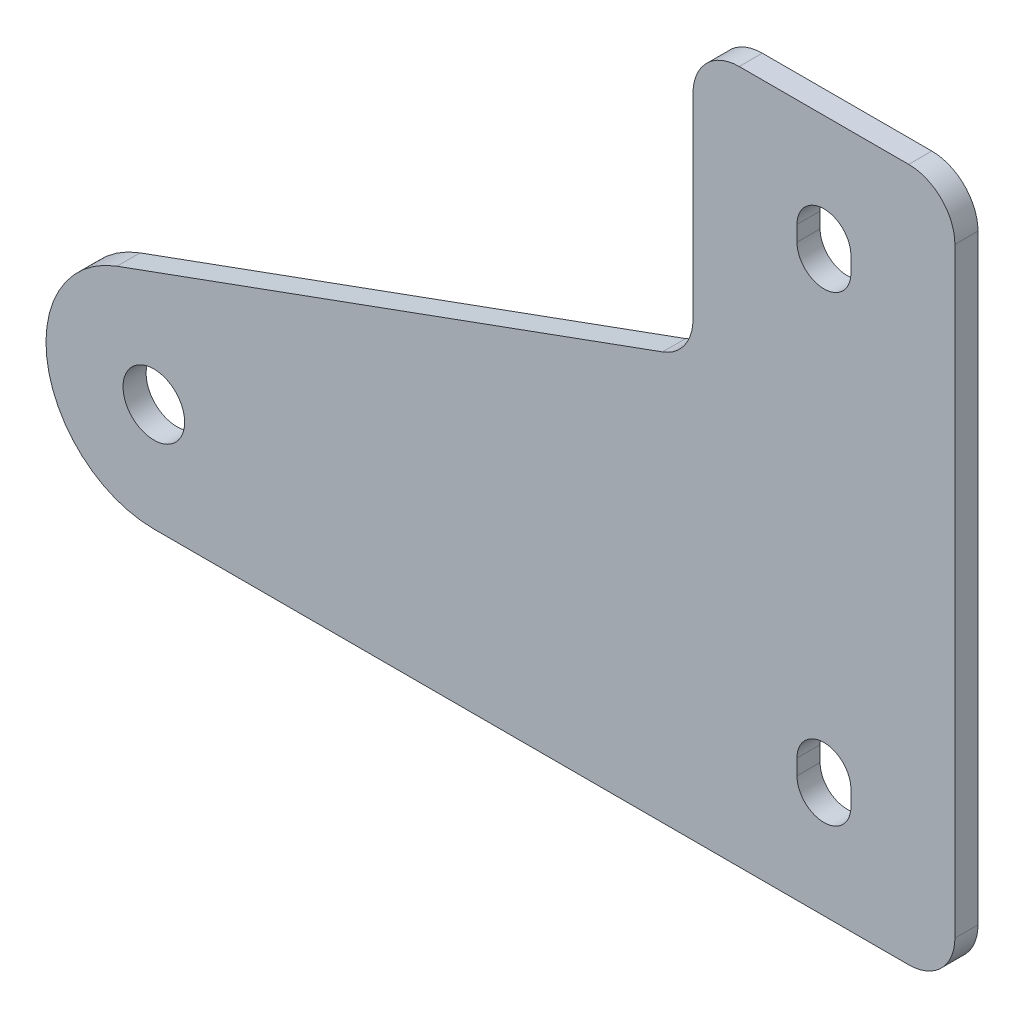
ISO-10303-21;
HEADER;
FILE_DESCRIPTION(('STEP AP214'),'2;1');
FILE_NAME('part.step','',(''),(''),'','','');
FILE_SCHEMA(('AUTOMOTIVE_DESIGN { 1 0 10303 214 1 1 1 1 }'));
ENDSEC;
DATA;
#1=APPLICATION_CONTEXT('core data for automotive mechanical design processes');
#2=APPLICATION_PROTOCOL_DEFINITION('international standard','automotive_design',2000,#1);
#3=PRODUCT_CONTEXT('',#1,'mechanical');
#4=PRODUCT('Part','Part','',(#3));
#5=PRODUCT_RELATED_PRODUCT_CATEGORY('part','',(#4));
#6=PRODUCT_DEFINITION_FORMATION('','',#4);
#7=PRODUCT_DEFINITION_CONTEXT('part definition',#1,'design');
#8=PRODUCT_DEFINITION('design','',#6,#7);
#9=PRODUCT_DEFINITION_SHAPE('','',#8);
#10=(LENGTH_UNIT() NAMED_UNIT(*) SI_UNIT(.MILLI.,.METRE.));
#11=(NAMED_UNIT(*) PLANE_ANGLE_UNIT() SI_UNIT($,.RADIAN.));
#12=(NAMED_UNIT(*) SI_UNIT($,.STERADIAN.) SOLID_ANGLE_UNIT());
#13=UNCERTAINTY_MEASURE_WITH_UNIT(LENGTH_MEASURE(1.E-05),#10,'distance_accuracy_value','');
#14=(GEOMETRIC_REPRESENTATION_CONTEXT(3) GLOBAL_UNCERTAINTY_ASSIGNED_CONTEXT((#13)) GLOBAL_UNIT_ASSIGNED_CONTEXT((#10,
#11,#12)) REPRESENTATION_CONTEXT('',''));
#15=CARTESIAN_POINT('',(0.,0.,0.));
#16=DIRECTION('',(0.,0.,1.));
#17=DIRECTION('',(1.,0.,0.));
#18=AXIS2_PLACEMENT_3D('',#15,#16,#17);
#19=CARTESIAN_POINT('',(-8.5,37.5,-1.5));
#20=DIRECTION('',(-1.,0.,0.));
#21=DIRECTION('',(0.,-1.,0.));
#22=AXIS2_PLACEMENT_3D('',#19,#20,#21);
#23=PLANE('',#22);
#24=DIRECTION('',(0.,-1.,0.));
#25=VECTOR('',#24,1.);
#26=CARTESIAN_POINT('',(-8.5,37.5,-1.5));
#27=LINE('',#26,#25);
#28=CARTESIAN_POINT('',(-8.5,34.5,-1.5));
#29=VERTEX_POINT('',#28);
#30=CARTESIAN_POINT('',(-8.5,21.7888252212776,-1.5));
#31=VERTEX_POINT('',#30);
#32=EDGE_CURVE('E246',#29,#31,#27,.T.);
#33=ORIENTED_EDGE('',*,*,#32,.T.);
#34=DIRECTION('',(0.,0.,1.));
#35=VECTOR('',#34,1.);
#36=CARTESIAN_POINT('',(-8.5,21.7888252212776,0.));
#37=LINE('',#36,#35);
#38=CARTESIAN_POINT('',(-8.5,21.7888252212776,0.));
#39=VERTEX_POINT('',#38);
#40=EDGE_CURVE('E285',#31,#39,#37,.T.);
#41=ORIENTED_EDGE('',*,*,#40,.T.);
#42=DIRECTION('',(0.,-1.,0.));
#43=VECTOR('',#42,1.);
#44=CARTESIAN_POINT('',(-8.5,37.5,0.));
#45=LINE('',#44,#43);
#46=CARTESIAN_POINT('',(-8.5,34.5,0.));
#47=VERTEX_POINT('',#46);
#48=EDGE_CURVE('E239',#47,#39,#45,.T.);
#49=ORIENTED_EDGE('',*,*,#48,.F.);
#50=DIRECTION('',(0.,0.,1.));
#51=VECTOR('',#50,1.);
#52=CARTESIAN_POINT('',(-8.5,34.5,-1.5));
#53=LINE('',#52,#51);
#54=EDGE_CURVE('E281',#47,#29,#53,.F.);
#55=ORIENTED_EDGE('',*,*,#54,.T.);
#56=EDGE_LOOP('',(#33,#41,#49,#55));
#57=FACE_BOUND('',#56,.T.);
#58=ADVANCED_FACE('F40',(#57),#23,.T.);
#59=CARTESIAN_POINT('',(-8.5,37.5,-1.5));
#60=DIRECTION('',(0.,1.,0.));
#61=DIRECTION('',(0.,0.,1.));
#62=AXIS2_PLACEMENT_3D('',#59,#60,#61);
#63=PLANE('',#62);
#64=DIRECTION('',(-1.,0.,0.));
#65=VECTOR('',#64,1.);
#66=CARTESIAN_POINT('',(-8.5,37.5,-1.5));
#67=LINE('',#66,#65);
#68=CARTESIAN_POINT('',(5.5,37.5,-1.5));
#69=VERTEX_POINT('',#68);
#70=CARTESIAN_POINT('',(-5.5,37.5,-1.5));
#71=VERTEX_POINT('',#70);
#72=EDGE_CURVE('E261',#69,#71,#67,.T.);
#73=ORIENTED_EDGE('',*,*,#72,.T.);
#74=DIRECTION('',(0.,0.,1.));
#75=VECTOR('',#74,1.);
#76=CARTESIAN_POINT('',(-5.5,37.5,-1.5));
#77=LINE('',#76,#75);
#78=CARTESIAN_POINT('',(-5.5,37.5,0.));
#79=VERTEX_POINT('',#78);
#80=EDGE_CURVE('E310',#71,#79,#77,.T.);
#81=ORIENTED_EDGE('',*,*,#80,.T.);
#82=DIRECTION('',(-1.,0.,0.));
#83=VECTOR('',#82,1.);
#84=CARTESIAN_POINT('',(-8.5,37.5,0.));
#85=LINE('',#84,#83);
#86=CARTESIAN_POINT('',(5.5,37.5,0.));
#87=VERTEX_POINT('',#86);
#88=EDGE_CURVE('E250',#87,#79,#85,.T.);
#89=ORIENTED_EDGE('',*,*,#88,.F.);
#90=DIRECTION('',(0.,0.,1.));
#91=VECTOR('',#90,1.);
#92=CARTESIAN_POINT('',(5.5,37.5,-1.5));
#93=LINE('',#92,#91);
#94=EDGE_CURVE('E62',#87,#69,#93,.F.);
#95=ORIENTED_EDGE('',*,*,#94,.T.);
#96=EDGE_LOOP('',(#73,#81,#89,#95));
#97=FACE_BOUND('',#96,.T.);
#98=ADVANCED_FACE('F333',(#97),#63,.T.);
#99=CARTESIAN_POINT('',(8.5,37.5,-1.5));
#100=DIRECTION('',(1.,0.,0.));
#101=DIRECTION('',(0.,1.,0.));
#102=AXIS2_PLACEMENT_3D('',#99,#100,#101);
#103=PLANE('',#102);
#104=DIRECTION('',(0.,1.,0.));
#105=VECTOR('',#104,1.);
#106=CARTESIAN_POINT('',(8.5,37.5,0.));
#107=LINE('',#106,#105);
#108=CARTESIAN_POINT('',(8.49999999999999,-4.49999999999998,0.));
#109=VERTEX_POINT('',#108);
#110=CARTESIAN_POINT('',(8.5,34.5,0.));
#111=VERTEX_POINT('',#110);
#112=EDGE_CURVE('E274',#109,#111,#107,.T.);
#113=ORIENTED_EDGE('',*,*,#112,.F.);
#114=DIRECTION('',(0.,0.,1.));
#115=VECTOR('',#114,1.);
#116=CARTESIAN_POINT('',(8.49999999999999,-4.5,-1.5));
#117=LINE('',#116,#115);
#118=CARTESIAN_POINT('',(8.49999999999999,-4.49999999999998,-1.5));
#119=VERTEX_POINT('',#118);
#120=EDGE_CURVE('E302',#109,#119,#117,.F.);
#121=ORIENTED_EDGE('',*,*,#120,.T.);
#122=DIRECTION('',(0.,1.,0.));
#123=VECTOR('',#122,1.);
#124=CARTESIAN_POINT('',(8.5,37.5,-1.5));
#125=LINE('',#124,#123);
#126=CARTESIAN_POINT('',(8.5,34.5,-1.5));
#127=VERTEX_POINT('',#126);
#128=EDGE_CURVE('E258',#119,#127,#125,.T.);
#129=ORIENTED_EDGE('',*,*,#128,.T.);
#130=DIRECTION('',(0.,0.,1.));
#131=VECTOR('',#130,1.);
#132=CARTESIAN_POINT('',(8.5,34.5,-1.5));
#133=LINE('',#132,#131);
#134=EDGE_CURVE('E299',#127,#111,#133,.T.);
#135=ORIENTED_EDGE('',*,*,#134,.T.);
#136=EDGE_LOOP('',(#113,#121,#129,#135));
#137=FACE_BOUND('',#136,.T.);
#138=ADVANCED_FACE('F339',(#137),#103,.T.);
#139=CARTESIAN_POINT('',(-43.5,-7.5,-1.5));
#140=DIRECTION('',(0.,-1.,0.));
#141=DIRECTION('',(1.,0.,0.));
#142=AXIS2_PLACEMENT_3D('',#139,#140,#141);
#143=PLANE('',#142);
#144=DIRECTION('',(1.,0.,0.));
#145=VECTOR('',#144,1.);
#146=CARTESIAN_POINT('',(-43.5,-7.5,-1.5));
#147=LINE('',#146,#145);
#148=CARTESIAN_POINT('',(-43.5,-7.5,-1.5));
#149=VERTEX_POINT('',#148);
#150=CARTESIAN_POINT('',(5.49999999999999,-7.5,-1.5));
#151=VERTEX_POINT('',#150);
#152=EDGE_CURVE('E255',#149,#151,#147,.T.);
#153=ORIENTED_EDGE('',*,*,#152,.T.);
#154=DIRECTION('',(0.,0.,1.));
#155=VECTOR('',#154,1.);
#156=CARTESIAN_POINT('',(5.49999999999999,-7.5,-1.5));
#157=LINE('',#156,#155);
#158=CARTESIAN_POINT('',(5.49999999999999,-7.5,0.));
#159=VERTEX_POINT('',#158);
#160=EDGE_CURVE('E290',#151,#159,#157,.T.);
#161=ORIENTED_EDGE('',*,*,#160,.T.);
#162=DIRECTION('',(1.,0.,0.));
#163=VECTOR('',#162,1.);
#164=CARTESIAN_POINT('',(-43.5,-7.5,0.));
#165=LINE('',#164,#163);
#166=CARTESIAN_POINT('',(-43.5,-7.5,0.));
#167=VERTEX_POINT('',#166);
#168=EDGE_CURVE('E271',#167,#159,#165,.T.);
#169=ORIENTED_EDGE('',*,*,#168,.F.);
#170=DIRECTION('',(0.,0.,1.));
#171=VECTOR('',#170,1.);
#172=CARTESIAN_POINT('',(-43.5,-7.5,-1.5));
#173=LINE('',#172,#171);
#174=EDGE_CURVE('E279',#149,#167,#173,.T.);
#175=ORIENTED_EDGE('',*,*,#174,.F.);
#176=EDGE_LOOP('',(#153,#161,#169,#175));
#177=FACE_BOUND('',#176,.T.);
#178=ADVANCED_FACE('F348',(#177),#143,.T.);
#179=CARTESIAN_POINT('',(-43.5,-0.5,-1.5));
#180=DIRECTION('',(0.,0.,1.));
#181=DIRECTION('',(1.,0.,0.));
#182=AXIS2_PLACEMENT_3D('',#179,#180,#181);
#183=CYLINDRICAL_SURFACE('',#182,7.);
#184=CARTESIAN_POINT('',(-43.5,-0.5,0.));
#185=DIRECTION('',(0.,0.,1.));
#186=DIRECTION('',(1.,0.,0.));
#187=AXIS2_PLACEMENT_3D('',#184,#185,#186);
#188=CIRCLE('',#187,7.);
#189=CARTESIAN_POINT('',(-45.8941410032797,6.07784834550136,0.));
#190=VERTEX_POINT('',#189);
#191=EDGE_CURVE('E268',#190,#167,#188,.T.);
#192=ORIENTED_EDGE('',*,*,#191,.F.);
#193=DIRECTION('',(0.,0.,1.));
#194=VECTOR('',#193,1.);
#195=CARTESIAN_POINT('',(-45.8941410032797,6.07784834550136,-1.5));
#196=LINE('',#195,#194);
#197=CARTESIAN_POINT('',(-45.8941410032797,6.07784834550136,-1.5));
#198=VERTEX_POINT('',#197);
#199=EDGE_CURVE('E263',#198,#190,#196,.T.);
#200=ORIENTED_EDGE('',*,*,#199,.F.);
#201=CARTESIAN_POINT('',(-43.5,-0.5,-1.5));
#202=DIRECTION('',(0.,0.,1.));
#203=DIRECTION('',(1.,0.,0.));
#204=AXIS2_PLACEMENT_3D('',#201,#202,#203);
#205=CIRCLE('',#204,7.);
#206=EDGE_CURVE('E252',#198,#149,#205,.T.);
#207=ORIENTED_EDGE('',*,*,#206,.T.);
#208=ORIENTED_EDGE('',*,*,#174,.T.);
#209=EDGE_LOOP('',(#192,#200,#207,#208));
#210=FACE_BOUND('',#209,.T.);
#211=ADVANCED_FACE('F350',(#210),#183,.T.);
#212=CARTESIAN_POINT('',(-45.8941410032797,6.07784834550136,-1.5));
#213=DIRECTION('',(-0.34202014332567,0.939692620785908,0.));
#214=DIRECTION('',(-0.939692620785908,-0.34202014332567,0.));
#215=AXIS2_PLACEMENT_3D('',#212,#213,#214);
#216=PLANE('',#215);
#217=DIRECTION('',(-0.939692620785908,-0.34202014332567,0.));
#218=VECTOR('',#217,1.);
#219=CARTESIAN_POINT('',(-45.8941410032797,6.07784834550136,0.));
#220=LINE('',#219,#218);
#221=CARTESIAN_POINT('',(-10.473939570023,18.9697473589199,0.));
#222=VERTEX_POINT('',#221);
#223=EDGE_CURVE('E266',#222,#190,#220,.T.);
#224=ORIENTED_EDGE('',*,*,#223,.F.);
#225=DIRECTION('',(0.,0.,1.));
#226=VECTOR('',#225,1.);
#227=CARTESIAN_POINT('',(-10.473939570023,18.9697473589199,-1.5));
#228=LINE('',#227,#226);
#229=CARTESIAN_POINT('',(-10.473939570023,18.9697473589199,-1.5));
#230=VERTEX_POINT('',#229);
#231=EDGE_CURVE('E288',#222,#230,#228,.F.);
#232=ORIENTED_EDGE('',*,*,#231,.T.);
#233=DIRECTION('',(-0.939692620785908,-0.34202014332567,0.));
#234=VECTOR('',#233,1.);
#235=CARTESIAN_POINT('',(-45.8941410032797,6.07784834550136,-1.5));
#236=LINE('',#235,#234);
#237=EDGE_CURVE('E249',#230,#198,#236,.T.);
#238=ORIENTED_EDGE('',*,*,#237,.T.);
#239=ORIENTED_EDGE('',*,*,#199,.T.);
#240=EDGE_LOOP('',(#224,#232,#238,#239));
#241=FACE_BOUND('',#240,.T.);
#242=ADVANCED_FACE('F320',(#241),#216,.T.);
#243=CARTESIAN_POINT('',(-43.5,-0.5,-1.5));
#244=DIRECTION('',(0.,0.,1.));
#245=DIRECTION('',(1.,0.,0.));
#246=AXIS2_PLACEMENT_3D('',#243,#244,#245);
#247=PLANE('',#246);
#248=CARTESIAN_POINT('',(-43.5,-0.5,-1.5));
#249=DIRECTION('',(0.,0.,1.));
#250=DIRECTION('',(1.,0.,0.));
#251=AXIS2_PLACEMENT_3D('',#248,#249,#250);
#252=CIRCLE('',#251,2.);
#253=CARTESIAN_POINT('',(-41.5,-0.5,-1.5));
#254=VERTEX_POINT('',#253);
#255=EDGE_CURVE('E204',#254,#254,#252,.T.);
#256=ORIENTED_EDGE('',*,*,#255,.T.);
#257=EDGE_LOOP('',(#256));
#258=FACE_BOUND('',#257,.T.);
#259=DIRECTION('',(0.,1.,0.));
#260=VECTOR('',#259,1.);
#261=CARTESIAN_POINT('',(1.75,30.5,-1.5));
#262=LINE('',#261,#260);
#263=CARTESIAN_POINT('',(1.75,29.5,-1.5));
#264=VERTEX_POINT('',#263);
#265=CARTESIAN_POINT('',(1.75,30.5,-1.5));
#266=VERTEX_POINT('',#265);
#267=EDGE_CURVE('E178',#264,#266,#262,.T.);
#268=ORIENTED_EDGE('',*,*,#267,.T.);
#269=CARTESIAN_POINT('',(0.,30.5,-1.5));
#270=DIRECTION('',(0.,0.,1.));
#271=DIRECTION('',(1.,0.,0.));
#272=AXIS2_PLACEMENT_3D('',#269,#270,#271);
#273=CIRCLE('',#272,1.75);
#274=CARTESIAN_POINT('',(-1.75,30.5,-1.5));
#275=VERTEX_POINT('',#274);
#276=EDGE_CURVE('E170',#266,#275,#273,.T.);
#277=ORIENTED_EDGE('',*,*,#276,.T.);
#278=DIRECTION('',(0.,-1.,0.));
#279=VECTOR('',#278,1.);
#280=CARTESIAN_POINT('',(-1.75,30.5,-1.5));
#281=LINE('',#280,#279);
#282=CARTESIAN_POINT('',(-1.75,29.5,-1.5));
#283=VERTEX_POINT('',#282);
#284=EDGE_CURVE('E182',#275,#283,#281,.T.);
#285=ORIENTED_EDGE('',*,*,#284,.T.);
#286=CARTESIAN_POINT('',(0.,29.5,-1.5));
#287=DIRECTION('',(0.,0.,1.));
#288=DIRECTION('',(1.,0.,0.));
#289=AXIS2_PLACEMENT_3D('',#286,#287,#288);
#290=CIRCLE('',#289,1.75);
#291=EDGE_CURVE('E186',#283,#264,#290,.T.);
#292=ORIENTED_EDGE('',*,*,#291,.T.);
#293=EDGE_LOOP('',(#268,#277,#285,#292));
#294=FACE_BOUND('',#293,.T.);
#295=DIRECTION('',(0.,1.,0.));
#296=VECTOR('',#295,1.);
#297=CARTESIAN_POINT('',(1.75,0.500000000000002,-1.5));
#298=LINE('',#297,#296);
#299=CARTESIAN_POINT('',(1.75,-0.5,-1.5));
#300=VERTEX_POINT('',#299);
#301=CARTESIAN_POINT('',(1.75,0.500000000000002,-1.5));
#302=VERTEX_POINT('',#301);
#303=EDGE_CURVE('E224',#300,#302,#298,.T.);
#304=ORIENTED_EDGE('',*,*,#303,.T.);
#305=CARTESIAN_POINT('',(0.,0.5,-1.5));
#306=DIRECTION('',(0.,0.,1.));
#307=DIRECTION('',(1.,0.,0.));
#308=AXIS2_PLACEMENT_3D('',#305,#306,#307);
#309=CIRCLE('',#308,1.75);
#310=CARTESIAN_POINT('',(-1.75,0.499999999999999,-1.5));
#311=VERTEX_POINT('',#310);
#312=EDGE_CURVE('E214',#302,#311,#309,.T.);
#313=ORIENTED_EDGE('',*,*,#312,.T.);
#314=DIRECTION('',(0.,-1.,0.));
#315=VECTOR('',#314,1.);
#316=CARTESIAN_POINT('',(-1.75,0.499999999999999,-1.5));
#317=LINE('',#316,#315);
#318=CARTESIAN_POINT('',(-1.75,-0.5,-1.5));
#319=VERTEX_POINT('',#318);
#320=EDGE_CURVE('E217',#311,#319,#317,.T.);
#321=ORIENTED_EDGE('',*,*,#320,.T.);
#322=CARTESIAN_POINT('',(0.,-0.5,-1.5));
#323=DIRECTION('',(0.,0.,1.));
#324=DIRECTION('',(1.,0.,0.));
#325=AXIS2_PLACEMENT_3D('',#322,#323,#324);
#326=CIRCLE('',#325,1.75);
#327=EDGE_CURVE('E221',#319,#300,#326,.T.);
#328=ORIENTED_EDGE('',*,*,#327,.T.);
#329=EDGE_LOOP('',(#304,#313,#321,#328));
#330=FACE_BOUND('',#329,.T.);
#331=ORIENTED_EDGE('',*,*,#128,.F.);
#332=CARTESIAN_POINT('',(5.49999999999999,-4.5,-1.5));
#333=DIRECTION('',(0.,0.,1.));
#334=DIRECTION('',(1.,0.,0.));
#335=AXIS2_PLACEMENT_3D('',#332,#333,#334);
#336=CIRCLE('',#335,3.);
#337=EDGE_CURVE('E307',#119,#151,#336,.F.);
#338=ORIENTED_EDGE('',*,*,#337,.T.);
#339=ORIENTED_EDGE('',*,*,#152,.F.);
#340=ORIENTED_EDGE('',*,*,#206,.F.);
#341=ORIENTED_EDGE('',*,*,#237,.F.);
#342=CARTESIAN_POINT('',(-11.5,21.7888252212776,-1.5));
#343=DIRECTION('',(0.,0.,1.));
#344=DIRECTION('',(1.,0.,0.));
#345=AXIS2_PLACEMENT_3D('',#342,#343,#344);
#346=CIRCLE('',#345,3.);
#347=EDGE_CURVE('E11',#230,#31,#346,.T.);
#348=ORIENTED_EDGE('',*,*,#347,.T.);
#349=ORIENTED_EDGE('',*,*,#32,.F.);
#350=CARTESIAN_POINT('',(-5.5,34.5,-1.5));
#351=DIRECTION('',(0.,0.,1.));
#352=DIRECTION('',(1.,0.,0.));
#353=AXIS2_PLACEMENT_3D('',#350,#351,#352);
#354=CIRCLE('',#353,3.);
#355=EDGE_CURVE('E55',#29,#71,#354,.F.);
#356=ORIENTED_EDGE('',*,*,#355,.T.);
#357=ORIENTED_EDGE('',*,*,#72,.F.);
#358=CARTESIAN_POINT('',(5.5,34.5,-1.5));
#359=DIRECTION('',(0.,0.,1.));
#360=DIRECTION('',(1.,0.,0.));
#361=AXIS2_PLACEMENT_3D('',#358,#359,#360);
#362=CIRCLE('',#361,3.);
#363=EDGE_CURVE('E304',#69,#127,#362,.F.);
#364=ORIENTED_EDGE('',*,*,#363,.T.);
#365=EDGE_LOOP('',(#331,#338,#339,#340,#341,#348,#349,#356,#357,#364));
#366=FACE_BOUND('',#365,.T.);
#367=ADVANCED_FACE('F188',(#258,#294,#330,#366),#247,.F.);
#368=CARTESIAN_POINT('',(-43.5,-0.5,0.));
#369=DIRECTION('',(0.,0.,1.));
#370=DIRECTION('',(1.,0.,0.));
#371=AXIS2_PLACEMENT_3D('',#368,#369,#370);
#372=PLANE('',#371);
#373=CARTESIAN_POINT('',(-43.5,-0.5,0.));
#374=DIRECTION('',(0.,0.,1.));
#375=DIRECTION('',(1.,0.,0.));
#376=AXIS2_PLACEMENT_3D('',#373,#374,#375);
#377=CIRCLE('',#376,2.);
#378=CARTESIAN_POINT('',(-41.5,-0.5,0.));
#379=VERTEX_POINT('',#378);
#380=EDGE_CURVE('E197',#379,#379,#377,.T.);
#381=ORIENTED_EDGE('',*,*,#380,.F.);
#382=EDGE_LOOP('',(#381));
#383=FACE_BOUND('',#382,.T.);
#384=CARTESIAN_POINT('',(0.,30.5,0.));
#385=DIRECTION('',(0.,0.,1.));
#386=DIRECTION('',(1.,0.,0.));
#387=AXIS2_PLACEMENT_3D('',#384,#385,#386);
#388=CIRCLE('',#387,1.75);
#389=CARTESIAN_POINT('',(1.75,30.5,0.));
#390=VERTEX_POINT('',#389);
#391=CARTESIAN_POINT('',(-1.75,30.5,0.));
#392=VERTEX_POINT('',#391);
#393=EDGE_CURVE('E173',#390,#392,#388,.T.);
#394=ORIENTED_EDGE('',*,*,#393,.F.);
#395=DIRECTION('',(0.,1.,0.));
#396=VECTOR('',#395,1.);
#397=CARTESIAN_POINT('',(1.75,30.5,0.));
#398=LINE('',#397,#396);
#399=CARTESIAN_POINT('',(1.75,29.5,0.));
#400=VERTEX_POINT('',#399);
#401=EDGE_CURVE('E191',#400,#390,#398,.T.);
#402=ORIENTED_EDGE('',*,*,#401,.F.);
#403=CARTESIAN_POINT('',(0.,29.5,0.));
#404=DIRECTION('',(0.,0.,1.));
#405=DIRECTION('',(1.,0.,0.));
#406=AXIS2_PLACEMENT_3D('',#403,#404,#405);
#407=CIRCLE('',#406,1.75);
#408=CARTESIAN_POINT('',(-1.75,29.5,0.));
#409=VERTEX_POINT('',#408);
#410=EDGE_CURVE('E194',#409,#400,#407,.T.);
#411=ORIENTED_EDGE('',*,*,#410,.F.);
#412=DIRECTION('',(0.,-1.,0.));
#413=VECTOR('',#412,1.);
#414=CARTESIAN_POINT('',(-1.75,30.5,0.));
#415=LINE('',#414,#413);
#416=EDGE_CURVE('E203',#392,#409,#415,.T.);
#417=ORIENTED_EDGE('',*,*,#416,.F.);
#418=EDGE_LOOP('',(#394,#402,#411,#417));
#419=FACE_BOUND('',#418,.T.);
#420=CARTESIAN_POINT('',(0.,0.5,0.));
#421=DIRECTION('',(0.,0.,1.));
#422=DIRECTION('',(1.,0.,0.));
#423=AXIS2_PLACEMENT_3D('',#420,#421,#422);
#424=CIRCLE('',#423,1.75);
#425=CARTESIAN_POINT('',(1.75,0.500000000000002,0.));
#426=VERTEX_POINT('',#425);
#427=CARTESIAN_POINT('',(-1.75,0.499999999999999,0.));
#428=VERTEX_POINT('',#427);
#429=EDGE_CURVE('E210',#426,#428,#424,.T.);
#430=ORIENTED_EDGE('',*,*,#429,.F.);
#431=DIRECTION('',(0.,1.,0.));
#432=VECTOR('',#431,1.);
#433=CARTESIAN_POINT('',(1.75,0.500000000000002,0.));
#434=LINE('',#433,#432);
#435=CARTESIAN_POINT('',(1.75,-0.5,0.));
#436=VERTEX_POINT('',#435);
#437=EDGE_CURVE('E218',#436,#426,#434,.T.);
#438=ORIENTED_EDGE('',*,*,#437,.F.);
#439=CARTESIAN_POINT('',(0.,-0.5,0.));
#440=DIRECTION('',(0.,0.,1.));
#441=DIRECTION('',(1.,0.,0.));
#442=AXIS2_PLACEMENT_3D('',#439,#440,#441);
#443=CIRCLE('',#442,1.75);
#444=CARTESIAN_POINT('',(-1.75,-0.5,0.));
#445=VERTEX_POINT('',#444);
#446=EDGE_CURVE('E232',#445,#436,#443,.T.);
#447=ORIENTED_EDGE('',*,*,#446,.F.);
#448=DIRECTION('',(0.,-1.,0.));
#449=VECTOR('',#448,1.);
#450=CARTESIAN_POINT('',(-1.75,0.499999999999999,0.));
#451=LINE('',#450,#449);
#452=EDGE_CURVE('E229',#428,#445,#451,.T.);
#453=ORIENTED_EDGE('',*,*,#452,.F.);
#454=EDGE_LOOP('',(#430,#438,#447,#453));
#455=FACE_BOUND('',#454,.T.);
#456=ORIENTED_EDGE('',*,*,#168,.T.);
#457=CARTESIAN_POINT('',(5.49999999999999,-4.5,0.));
#458=DIRECTION('',(0.,0.,1.));
#459=DIRECTION('',(1.,0.,0.));
#460=AXIS2_PLACEMENT_3D('',#457,#458,#459);
#461=CIRCLE('',#460,3.);
#462=EDGE_CURVE('E297',#159,#109,#461,.T.);
#463=ORIENTED_EDGE('',*,*,#462,.T.);
#464=ORIENTED_EDGE('',*,*,#112,.T.);
#465=CARTESIAN_POINT('',(5.5,34.5,0.));
#466=DIRECTION('',(0.,0.,1.));
#467=DIRECTION('',(1.,0.,0.));
#468=AXIS2_PLACEMENT_3D('',#465,#466,#467);
#469=CIRCLE('',#468,3.);
#470=EDGE_CURVE('E293',#111,#87,#469,.T.);
#471=ORIENTED_EDGE('',*,*,#470,.T.);
#472=ORIENTED_EDGE('',*,*,#88,.T.);
#473=CARTESIAN_POINT('',(-5.5,34.5,0.));
#474=DIRECTION('',(0.,0.,1.));
#475=DIRECTION('',(1.,0.,0.));
#476=AXIS2_PLACEMENT_3D('',#473,#474,#475);
#477=CIRCLE('',#476,3.);
#478=EDGE_CURVE('E295',#79,#47,#477,.T.);
#479=ORIENTED_EDGE('',*,*,#478,.T.);
#480=ORIENTED_EDGE('',*,*,#48,.T.);
#481=CARTESIAN_POINT('',(-11.5,21.7888252212776,0.));
#482=DIRECTION('',(0.,0.,1.));
#483=DIRECTION('',(1.,0.,0.));
#484=AXIS2_PLACEMENT_3D('',#481,#482,#483);
#485=CIRCLE('',#484,3.);
#486=EDGE_CURVE('E48',#39,#222,#485,.F.);
#487=ORIENTED_EDGE('',*,*,#486,.T.);
#488=ORIENTED_EDGE('',*,*,#223,.T.);
#489=ORIENTED_EDGE('',*,*,#191,.T.);
#490=EDGE_LOOP('',(#456,#463,#464,#471,#472,#479,#480,#487,#488,#489));
#491=FACE_BOUND('',#490,.T.);
#492=ADVANCED_FACE('F314',(#383,#419,#455,#491),#372,.T.);
#493=CARTESIAN_POINT('',(0.,0.5,-1.5));
#494=DIRECTION('',(0.,0.,1.));
#495=DIRECTION('',(1.,0.,0.));
#496=AXIS2_PLACEMENT_3D('',#493,#494,#495);
#497=CYLINDRICAL_SURFACE('',#496,1.75);
#498=ORIENTED_EDGE('',*,*,#429,.T.);
#499=DIRECTION('',(0.,0.,1.));
#500=VECTOR('',#499,1.);
#501=CARTESIAN_POINT('',(-1.75,0.499999999999999,-1.5));
#502=LINE('',#501,#500);
#503=EDGE_CURVE('E227',#311,#428,#502,.T.);
#504=ORIENTED_EDGE('',*,*,#503,.F.);
#505=ORIENTED_EDGE('',*,*,#312,.F.);
#506=DIRECTION('',(0.,0.,1.));
#507=VECTOR('',#506,1.);
#508=CARTESIAN_POINT('',(1.75,0.500000000000002,-1.5));
#509=LINE('',#508,#507);
#510=EDGE_CURVE('E237',#302,#426,#509,.T.);
#511=ORIENTED_EDGE('',*,*,#510,.T.);
#512=EDGE_LOOP('',(#498,#504,#505,#511));
#513=FACE_BOUND('',#512,.T.);
#514=ADVANCED_FACE('F403',(#513),#497,.F.);
#515=CARTESIAN_POINT('',(1.75,0.500000000000002,-1.5));
#516=DIRECTION('',(1.,0.,0.));
#517=DIRECTION('',(0.,1.,0.));
#518=AXIS2_PLACEMENT_3D('',#515,#516,#517);
#519=PLANE('',#518);
#520=ORIENTED_EDGE('',*,*,#437,.T.);
#521=ORIENTED_EDGE('',*,*,#510,.F.);
#522=ORIENTED_EDGE('',*,*,#303,.F.);
#523=DIRECTION('',(0.,0.,1.));
#524=VECTOR('',#523,1.);
#525=CARTESIAN_POINT('',(1.75,-0.5,-1.5));
#526=LINE('',#525,#524);
#527=EDGE_CURVE('E240',#300,#436,#526,.T.);
#528=ORIENTED_EDGE('',*,*,#527,.T.);
#529=EDGE_LOOP('',(#520,#521,#522,#528));
#530=FACE_BOUND('',#529,.T.);
#531=ADVANCED_FACE('F522',(#530),#519,.F.);
#532=CARTESIAN_POINT('',(0.,-0.5,-1.5));
#533=DIRECTION('',(0.,0.,1.));
#534=DIRECTION('',(1.,0.,0.));
#535=AXIS2_PLACEMENT_3D('',#532,#533,#534);
#536=CYLINDRICAL_SURFACE('',#535,1.75);
#537=ORIENTED_EDGE('',*,*,#446,.T.);
#538=ORIENTED_EDGE('',*,*,#527,.F.);
#539=ORIENTED_EDGE('',*,*,#327,.F.);
#540=DIRECTION('',(0.,0.,1.));
#541=VECTOR('',#540,1.);
#542=CARTESIAN_POINT('',(-1.75,-0.5,-1.5));
#543=LINE('',#542,#541);
#544=EDGE_CURVE('E242',#319,#445,#543,.T.);
#545=ORIENTED_EDGE('',*,*,#544,.T.);
#546=EDGE_LOOP('',(#537,#538,#539,#545));
#547=FACE_BOUND('',#546,.T.);
#548=ADVANCED_FACE('F511',(#547),#536,.F.);
#549=CARTESIAN_POINT('',(-1.75,0.499999999999999,-1.5));
#550=DIRECTION('',(-1.,0.,0.));
#551=DIRECTION('',(0.,-1.,0.));
#552=AXIS2_PLACEMENT_3D('',#549,#550,#551);
#553=PLANE('',#552);
#554=ORIENTED_EDGE('',*,*,#452,.T.);
#555=ORIENTED_EDGE('',*,*,#544,.F.);
#556=ORIENTED_EDGE('',*,*,#320,.F.);
#557=ORIENTED_EDGE('',*,*,#503,.T.);
#558=EDGE_LOOP('',(#554,#555,#556,#557));
#559=FACE_BOUND('',#558,.T.);
#560=ADVANCED_FACE('F501',(#559),#553,.F.);
#561=CARTESIAN_POINT('',(0.,30.5,-1.5));
#562=DIRECTION('',(0.,0.,1.));
#563=DIRECTION('',(1.,0.,0.));
#564=AXIS2_PLACEMENT_3D('',#561,#562,#563);
#565=CYLINDRICAL_SURFACE('',#564,1.75);
#566=ORIENTED_EDGE('',*,*,#393,.T.);
#567=DIRECTION('',(0.,0.,1.));
#568=VECTOR('',#567,1.);
#569=CARTESIAN_POINT('',(-1.75,30.5,-1.5));
#570=LINE('',#569,#568);
#571=EDGE_CURVE('E166',#275,#392,#570,.T.);
#572=ORIENTED_EDGE('',*,*,#571,.F.);
#573=ORIENTED_EDGE('',*,*,#276,.F.);
#574=DIRECTION('',(0.,0.,1.));
#575=VECTOR('',#574,1.);
#576=CARTESIAN_POINT('',(1.75,30.5,-1.5));
#577=LINE('',#576,#575);
#578=EDGE_CURVE('E208',#266,#390,#577,.T.);
#579=ORIENTED_EDGE('',*,*,#578,.T.);
#580=EDGE_LOOP('',(#566,#572,#573,#579));
#581=FACE_BOUND('',#580,.T.);
#582=ADVANCED_FACE('F168',(#581),#565,.F.);
#583=CARTESIAN_POINT('',(1.75,30.5,-1.5));
#584=DIRECTION('',(1.,0.,0.));
#585=DIRECTION('',(0.,1.,0.));
#586=AXIS2_PLACEMENT_3D('',#583,#584,#585);
#587=PLANE('',#586);
#588=ORIENTED_EDGE('',*,*,#401,.T.);
#589=ORIENTED_EDGE('',*,*,#578,.F.);
#590=ORIENTED_EDGE('',*,*,#267,.F.);
#591=DIRECTION('',(0.,0.,1.));
#592=VECTOR('',#591,1.);
#593=CARTESIAN_POINT('',(1.75,29.5,-1.5));
#594=LINE('',#593,#592);
#595=EDGE_CURVE('E211',#264,#400,#594,.T.);
#596=ORIENTED_EDGE('',*,*,#595,.T.);
#597=EDGE_LOOP('',(#588,#589,#590,#596));
#598=FACE_BOUND('',#597,.T.);
#599=ADVANCED_FACE('F480',(#598),#587,.F.);
#600=CARTESIAN_POINT('',(0.,29.5,-1.5));
#601=DIRECTION('',(0.,0.,1.));
#602=DIRECTION('',(1.,0.,0.));
#603=AXIS2_PLACEMENT_3D('',#600,#601,#602);
#604=CYLINDRICAL_SURFACE('',#603,1.75);
#605=ORIENTED_EDGE('',*,*,#410,.T.);
#606=ORIENTED_EDGE('',*,*,#595,.F.);
#607=ORIENTED_EDGE('',*,*,#291,.F.);
#608=DIRECTION('',(0.,0.,1.));
#609=VECTOR('',#608,1.);
#610=CARTESIAN_POINT('',(-1.75,29.5,-1.5));
#611=LINE('',#610,#609);
#612=EDGE_CURVE('E177',#283,#409,#611,.T.);
#613=ORIENTED_EDGE('',*,*,#612,.T.);
#614=EDGE_LOOP('',(#605,#606,#607,#613));
#615=FACE_BOUND('',#614,.T.);
#616=ADVANCED_FACE('F470',(#615),#604,.F.);
#617=CARTESIAN_POINT('',(-1.75,30.5,-1.5));
#618=DIRECTION('',(-1.,0.,0.));
#619=DIRECTION('',(0.,-1.,0.));
#620=AXIS2_PLACEMENT_3D('',#617,#618,#619);
#621=PLANE('',#620);
#622=ORIENTED_EDGE('',*,*,#416,.T.);
#623=ORIENTED_EDGE('',*,*,#612,.F.);
#624=ORIENTED_EDGE('',*,*,#284,.F.);
#625=ORIENTED_EDGE('',*,*,#571,.T.);
#626=EDGE_LOOP('',(#622,#623,#624,#625));
#627=FACE_BOUND('',#626,.T.);
#628=ADVANCED_FACE('F183',(#627),#621,.F.);
#629=CARTESIAN_POINT('',(-43.5,-0.5,-1.5));
#630=DIRECTION('',(0.,0.,1.));
#631=DIRECTION('',(1.,0.,0.));
#632=AXIS2_PLACEMENT_3D('',#629,#630,#631);
#633=CYLINDRICAL_SURFACE('',#632,2.);
#634=ORIENTED_EDGE('',*,*,#255,.F.);
#635=EDGE_LOOP('',(#634));
#636=FACE_BOUND('',#635,.T.);
#637=ORIENTED_EDGE('',*,*,#380,.T.);
#638=EDGE_LOOP('',(#637));
#639=FACE_BOUND('',#638,.T.);
#640=ADVANCED_FACE('F368',(#636,#639),#633,.F.);
#641=CARTESIAN_POINT('',(-11.5,21.7888252212776,-1.5));
#642=DIRECTION('',(0.,0.,-1.));
#643=DIRECTION('',(-1.,0.,0.));
#644=AXIS2_PLACEMENT_3D('',#641,#642,#643);
#645=CYLINDRICAL_SURFACE('',#644,3.);
#646=ORIENTED_EDGE('',*,*,#347,.F.);
#647=ORIENTED_EDGE('',*,*,#231,.F.);
#648=ORIENTED_EDGE('',*,*,#486,.F.);
#649=ORIENTED_EDGE('',*,*,#40,.F.);
#650=EDGE_LOOP('',(#646,#647,#648,#649));
#651=FACE_BOUND('',#650,.T.);
#652=ADVANCED_FACE('F325',(#651),#645,.F.);
#653=CARTESIAN_POINT('',(5.49999999999999,-4.5,-1.5));
#654=DIRECTION('',(0.,0.,1.));
#655=DIRECTION('',(1.,0.,0.));
#656=AXIS2_PLACEMENT_3D('',#653,#654,#655);
#657=CYLINDRICAL_SURFACE('',#656,3.);
#658=ORIENTED_EDGE('',*,*,#337,.F.);
#659=ORIENTED_EDGE('',*,*,#120,.F.);
#660=ORIENTED_EDGE('',*,*,#462,.F.);
#661=ORIENTED_EDGE('',*,*,#160,.F.);
#662=EDGE_LOOP('',(#658,#659,#660,#661));
#663=FACE_BOUND('',#662,.T.);
#664=ADVANCED_FACE('F345',(#663),#657,.T.);
#665=CARTESIAN_POINT('',(-5.5,34.5,-1.5));
#666=DIRECTION('',(0.,0.,1.));
#667=DIRECTION('',(1.,0.,0.));
#668=AXIS2_PLACEMENT_3D('',#665,#666,#667);
#669=CYLINDRICAL_SURFACE('',#668,3.);
#670=ORIENTED_EDGE('',*,*,#355,.F.);
#671=ORIENTED_EDGE('',*,*,#54,.F.);
#672=ORIENTED_EDGE('',*,*,#478,.F.);
#673=ORIENTED_EDGE('',*,*,#80,.F.);
#674=EDGE_LOOP('',(#670,#671,#672,#673));
#675=FACE_BOUND('',#674,.T.);
#676=ADVANCED_FACE('F331',(#675),#669,.T.);
#677=CARTESIAN_POINT('',(5.5,34.5,-1.5));
#678=DIRECTION('',(0.,0.,1.));
#679=DIRECTION('',(1.,0.,0.));
#680=AXIS2_PLACEMENT_3D('',#677,#678,#679);
#681=CYLINDRICAL_SURFACE('',#680,3.);
#682=ORIENTED_EDGE('',*,*,#363,.F.);
#683=ORIENTED_EDGE('',*,*,#94,.F.);
#684=ORIENTED_EDGE('',*,*,#470,.F.);
#685=ORIENTED_EDGE('',*,*,#134,.F.);
#686=EDGE_LOOP('',(#682,#683,#684,#685));
#687=FACE_BOUND('',#686,.T.);
#688=ADVANCED_FACE('F42',(#687),#681,.T.);
#689=CLOSED_SHELL('',(#58,#98,#138,#178,#211,#242,#367,#492,#514,#531,#548,#560,#582,#599,#616,
#628,#640,#652,#664,#676,#688));
#690=MANIFOLD_SOLID_BREP('B2',#689);
#691=ADVANCED_BREP_SHAPE_REPRESENTATION('',(#18,#690),#14);
#692=SHAPE_DEFINITION_REPRESENTATION(#9,#691);
ENDSEC;
END-ISO-10303-21;
